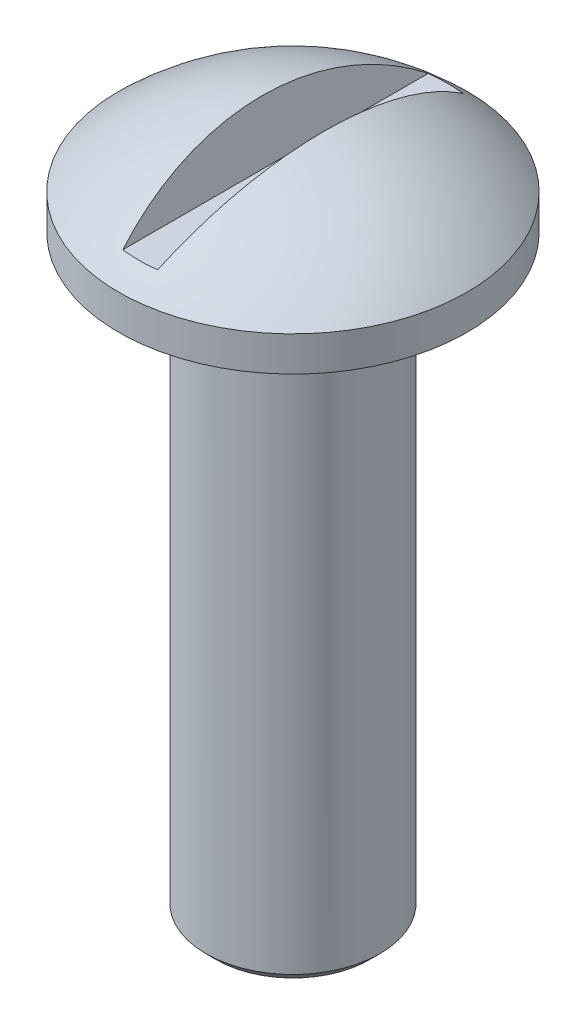
ISO-10303-21;
HEADER;
FILE_DESCRIPTION(('STEP AP214'),'2;1');
FILE_NAME('part.step','',(''),(''),'','','');
FILE_SCHEMA(('AUTOMOTIVE_DESIGN { 1 0 10303 214 1 1 1 1 }'));
ENDSEC;
DATA;
#1=APPLICATION_CONTEXT('core data for automotive mechanical design processes');
#2=APPLICATION_PROTOCOL_DEFINITION('international standard','automotive_design',2000,#1);
#3=PRODUCT_CONTEXT('',#1,'mechanical');
#4=PRODUCT('Part','Part','',(#3));
#5=PRODUCT_RELATED_PRODUCT_CATEGORY('part','',(#4));
#6=PRODUCT_DEFINITION_FORMATION('','',#4);
#7=PRODUCT_DEFINITION_CONTEXT('part definition',#1,'design');
#8=PRODUCT_DEFINITION('design','',#6,#7);
#9=PRODUCT_DEFINITION_SHAPE('','',#8);
#10=(LENGTH_UNIT() NAMED_UNIT(*) SI_UNIT(.MILLI.,.METRE.));
#11=(NAMED_UNIT(*) PLANE_ANGLE_UNIT() SI_UNIT($,.RADIAN.));
#12=(NAMED_UNIT(*) SI_UNIT($,.STERADIAN.) SOLID_ANGLE_UNIT());
#13=UNCERTAINTY_MEASURE_WITH_UNIT(LENGTH_MEASURE(1.E-05),#10,'distance_accuracy_value','');
#14=(GEOMETRIC_REPRESENTATION_CONTEXT(3) GLOBAL_UNCERTAINTY_ASSIGNED_CONTEXT((#13)) GLOBAL_UNIT_ASSIGNED_CONTEXT((#10,
#11,#12)) REPRESENTATION_CONTEXT('',''));
#15=CARTESIAN_POINT('',(0.,0.,0.));
#16=DIRECTION('',(0.,0.,1.));
#17=DIRECTION('',(1.,0.,0.));
#18=AXIS2_PLACEMENT_3D('',#15,#16,#17);
#19=CARTESIAN_POINT('',(-6.34999999999999,0.,0.));
#20=DIRECTION('',(0.,1.,0.));
#21=DIRECTION('',(0.,0.,1.));
#22=AXIS2_PLACEMENT_3D('',#19,#20,#21);
#23=PLANE('',#22);
#24=CARTESIAN_POINT('',(0.,0.,0.));
#25=DIRECTION('',(0.,1.,0.));
#26=DIRECTION('',(0.,0.,1.));
#27=AXIS2_PLACEMENT_3D('',#24,#25,#26);
#28=CIRCLE('',#27,5.58799999999999);
#29=CARTESIAN_POINT('',(0.,0.,5.58799999999999));
#30=VERTEX_POINT('',#29);
#31=EDGE_CURVE('E53',#30,#30,#28,.F.);
#32=ORIENTED_EDGE('',*,*,#31,.T.);
#33=EDGE_LOOP('',(#32));
#34=FACE_BOUND('',#33,.T.);
#35=ADVANCED_FACE('F43',(#34),#23,.F.);
#36=CARTESIAN_POINT('',(0.,32.385,0.));
#37=DIRECTION('',(0.,0.,1.));
#38=DIRECTION('',(1.,0.,0.));
#39=AXIS2_PLACEMENT_3D('',#36,#37,#38);
#40=SPHERICAL_SURFACE('',#39,18.415);
#41=CARTESIAN_POINT('',(0.,46.99,0.));
#42=DIRECTION('',(0.,-1.,0.));
#43=DIRECTION('',(0.,0.,-1.));
#44=AXIS2_PLACEMENT_3D('',#41,#42,#43);
#45=CIRCLE('',#44,11.2163363002364);
#46=CARTESIAN_POINT('',(-1.27,46.99,-11.144204771988));
#47=VERTEX_POINT('',#46);
#48=CARTESIAN_POINT('',(1.27,46.99,-11.144204771988));
#49=VERTEX_POINT('',#48);
#50=EDGE_CURVE('E78',#47,#49,#45,.T.);
#51=ORIENTED_EDGE('',*,*,#50,.T.);
#52=CARTESIAN_POINT('',(-2.46632386859689,33.0458494888641,0.));
#53=DIRECTION('',(0.965925826289068,-0.258819045102522,0.));
#54=DIRECTION('',(0.258819045102522,0.965925826289068,0.));
#55=AXIS2_PLACEMENT_3D('',#52,#53,#54);
#56=CIRCLE('',#55,18.2371255829491);
#57=CARTESIAN_POINT('',(1.27,46.99,11.144204771988));
#58=VERTEX_POINT('',#57);
#59=EDGE_CURVE('E88',#49,#58,#56,.T.);
#60=ORIENTED_EDGE('',*,*,#59,.T.);
#61=CARTESIAN_POINT('',(-1.27,46.99,11.144204771988));
#62=VERTEX_POINT('',#61);
#63=EDGE_CURVE('E66',#58,#62,#45,.T.);
#64=ORIENTED_EDGE('',*,*,#63,.T.);
#65=CARTESIAN_POINT('',(2.46632386859689,33.0458494888641,0.));
#66=DIRECTION('',(-0.965925826289068,-0.258819045102522,0.));
#67=DIRECTION('',(0.258819045102522,-0.965925826289068,0.));
#68=AXIS2_PLACEMENT_3D('',#65,#66,#67);
#69=CIRCLE('',#68,18.2371255829491);
#70=EDGE_CURVE('E73',#62,#47,#69,.T.);
#71=ORIENTED_EDGE('',*,*,#70,.T.);
#72=EDGE_LOOP('',(#51,#60,#64,#71));
#73=FACE_BOUND('',#72,.T.);
#74=CARTESIAN_POINT('',(0.,45.72,0.));
#75=DIRECTION('',(0.,-1.,0.));
#76=DIRECTION('',(0.,0.,-1.));
#77=AXIS2_PLACEMENT_3D('',#74,#75,#76);
#78=CIRCLE('',#77,12.7);
#79=CARTESIAN_POINT('',(0.,45.72,-12.7));
#80=VERTEX_POINT('',#79);
#81=EDGE_CURVE('E79',#80,#80,#78,.T.);
#82=ORIENTED_EDGE('',*,*,#81,.F.);
#83=EDGE_LOOP('',(#82));
#84=FACE_BOUND('',#83,.T.);
#85=ADVANCED_FACE('F86',(#73,#84),#40,.T.);
#86=CARTESIAN_POINT('',(0.,0.,0.));
#87=DIRECTION('',(0.,-1.,0.));
#88=DIRECTION('',(0.,0.,-1.));
#89=AXIS2_PLACEMENT_3D('',#86,#87,#88);
#90=CYLINDRICAL_SURFACE('',#89,12.7);
#91=CARTESIAN_POINT('',(0.,43.18,0.));
#92=DIRECTION('',(0.,-1.,0.));
#93=DIRECTION('',(0.,0.,-1.));
#94=AXIS2_PLACEMENT_3D('',#91,#92,#93);
#95=CIRCLE('',#94,12.7);
#96=CARTESIAN_POINT('',(0.,43.18,-12.7));
#97=VERTEX_POINT('',#96);
#98=EDGE_CURVE('E187',#97,#97,#95,.T.);
#99=ORIENTED_EDGE('',*,*,#98,.F.);
#100=EDGE_LOOP('',(#99));
#101=FACE_BOUND('',#100,.T.);
#102=ORIENTED_EDGE('',*,*,#81,.T.);
#103=EDGE_LOOP('',(#102));
#104=FACE_BOUND('',#103,.T.);
#105=ADVANCED_FACE('F112',(#101,#104),#90,.T.);
#106=CARTESIAN_POINT('',(-12.7,43.18,0.));
#107=DIRECTION('',(0.,1.,0.));
#108=DIRECTION('',(0.,0.,1.));
#109=AXIS2_PLACEMENT_3D('',#106,#107,#108);
#110=PLANE('',#109);
#111=CARTESIAN_POINT('',(0.,43.18,0.));
#112=DIRECTION('',(0.,-1.,0.));
#113=DIRECTION('',(0.,0.,-1.));
#114=AXIS2_PLACEMENT_3D('',#111,#112,#113);
#115=CIRCLE('',#114,6.35);
#116=CARTESIAN_POINT('',(0.,43.18,-6.35));
#117=VERTEX_POINT('',#116);
#118=EDGE_CURVE('E183',#117,#117,#115,.T.);
#119=ORIENTED_EDGE('',*,*,#118,.F.);
#120=EDGE_LOOP('',(#119));
#121=FACE_BOUND('',#120,.T.);
#122=ORIENTED_EDGE('',*,*,#98,.T.);
#123=EDGE_LOOP('',(#122));
#124=FACE_BOUND('',#123,.T.);
#125=ADVANCED_FACE('F116',(#121,#124),#110,.F.);
#126=CARTESIAN_POINT('',(0.,0.,0.));
#127=DIRECTION('',(0.,-1.,0.));
#128=DIRECTION('',(0.,0.,-1.));
#129=AXIS2_PLACEMENT_3D('',#126,#127,#128);
#130=CYLINDRICAL_SURFACE('',#129,6.35);
#131=CARTESIAN_POINT('',(0.,0.762000000000015,0.));
#132=DIRECTION('',(0.,1.,0.));
#133=DIRECTION('',(0.,0.,1.));
#134=AXIS2_PLACEMENT_3D('',#131,#132,#133);
#135=CIRCLE('',#134,6.35);
#136=CARTESIAN_POINT('',(0.,0.762000000000015,6.35));
#137=VERTEX_POINT('',#136);
#138=EDGE_CURVE('E11',#137,#137,#135,.T.);
#139=ORIENTED_EDGE('',*,*,#138,.T.);
#140=EDGE_LOOP('',(#139));
#141=FACE_BOUND('',#140,.T.);
#142=ORIENTED_EDGE('',*,*,#118,.T.);
#143=EDGE_LOOP('',(#142));
#144=FACE_BOUND('',#143,.T.);
#145=ADVANCED_FACE('F120',(#141,#144),#130,.T.);
#146=CARTESIAN_POINT('',(1.27,46.99,-12.7));
#147=DIRECTION('',(0.965925826289068,-0.258819045102522,0.));
#148=DIRECTION('',(0.258819045102522,0.965925826289068,0.));
#149=AXIS2_PLACEMENT_3D('',#146,#147,#148);
#150=PLANE('',#149);
#151=DIRECTION('',(0.,0.,1.));
#152=VECTOR('',#151,1.);
#153=CARTESIAN_POINT('',(1.27,46.99,-12.7));
#154=LINE('',#153,#152);
#155=EDGE_CURVE('E83',#49,#58,#154,.T.);
#156=ORIENTED_EDGE('',*,*,#155,.T.);
#157=ORIENTED_EDGE('',*,*,#59,.F.);
#158=EDGE_LOOP('',(#156,#157));
#159=FACE_BOUND('',#158,.T.);
#160=ADVANCED_FACE('F124',(#159),#150,.F.);
#161=CARTESIAN_POINT('',(1.27,46.99,-12.7));
#162=DIRECTION('',(0.,-1.,0.));
#163=DIRECTION('',(0.,0.,-1.));
#164=AXIS2_PLACEMENT_3D('',#161,#162,#163);
#165=PLANE('',#164);
#166=ORIENTED_EDGE('',*,*,#155,.F.);
#167=ORIENTED_EDGE('',*,*,#50,.F.);
#168=DIRECTION('',(0.,0.,1.));
#169=VECTOR('',#168,1.);
#170=CARTESIAN_POINT('',(-1.27,46.99,-12.7));
#171=LINE('',#170,#169);
#172=EDGE_CURVE('E59',#47,#62,#171,.T.);
#173=ORIENTED_EDGE('',*,*,#172,.T.);
#174=ORIENTED_EDGE('',*,*,#63,.F.);
#175=EDGE_LOOP('',(#166,#167,#173,#174));
#176=FACE_BOUND('',#175,.T.);
#177=ADVANCED_FACE('F81',(#176),#165,.F.);
#178=CARTESIAN_POINT('',(-1.27,46.99,-12.7));
#179=DIRECTION('',(-0.965925826289068,-0.258819045102522,0.));
#180=DIRECTION('',(0.258819045102522,-0.965925826289068,0.));
#181=AXIS2_PLACEMENT_3D('',#178,#179,#180);
#182=PLANE('',#181);
#183=ORIENTED_EDGE('',*,*,#172,.F.);
#184=ORIENTED_EDGE('',*,*,#70,.F.);
#185=EDGE_LOOP('',(#183,#184));
#186=FACE_BOUND('',#185,.T.);
#187=ADVANCED_FACE('F74',(#186),#182,.F.);
#188=CARTESIAN_POINT('',(0.,0.,0.));
#189=DIRECTION('',(0.,1.,0.));
#190=DIRECTION('',(0.,0.,1.));
#191=AXIS2_PLACEMENT_3D('',#188,#189,#190);
#192=CONICAL_SURFACE('',#191,5.58799999999999,0.785398163397443);
#193=ORIENTED_EDGE('',*,*,#138,.F.);
#194=EDGE_LOOP('',(#193));
#195=FACE_BOUND('',#194,.T.);
#196=ORIENTED_EDGE('',*,*,#31,.F.);
#197=EDGE_LOOP('',(#196));
#198=FACE_BOUND('',#197,.T.);
#199=ADVANCED_FACE('F46',(#195,#198),#192,.T.);
#200=CLOSED_SHELL('',(#35,#85,#105,#125,#145,#160,#177,#187,#199));
#201=MANIFOLD_SOLID_BREP('B2',#200);
#202=ADVANCED_BREP_SHAPE_REPRESENTATION('',(#18,#201),#14);
#203=SHAPE_DEFINITION_REPRESENTATION(#9,#202);
ENDSEC;
END-ISO-10303-21;
